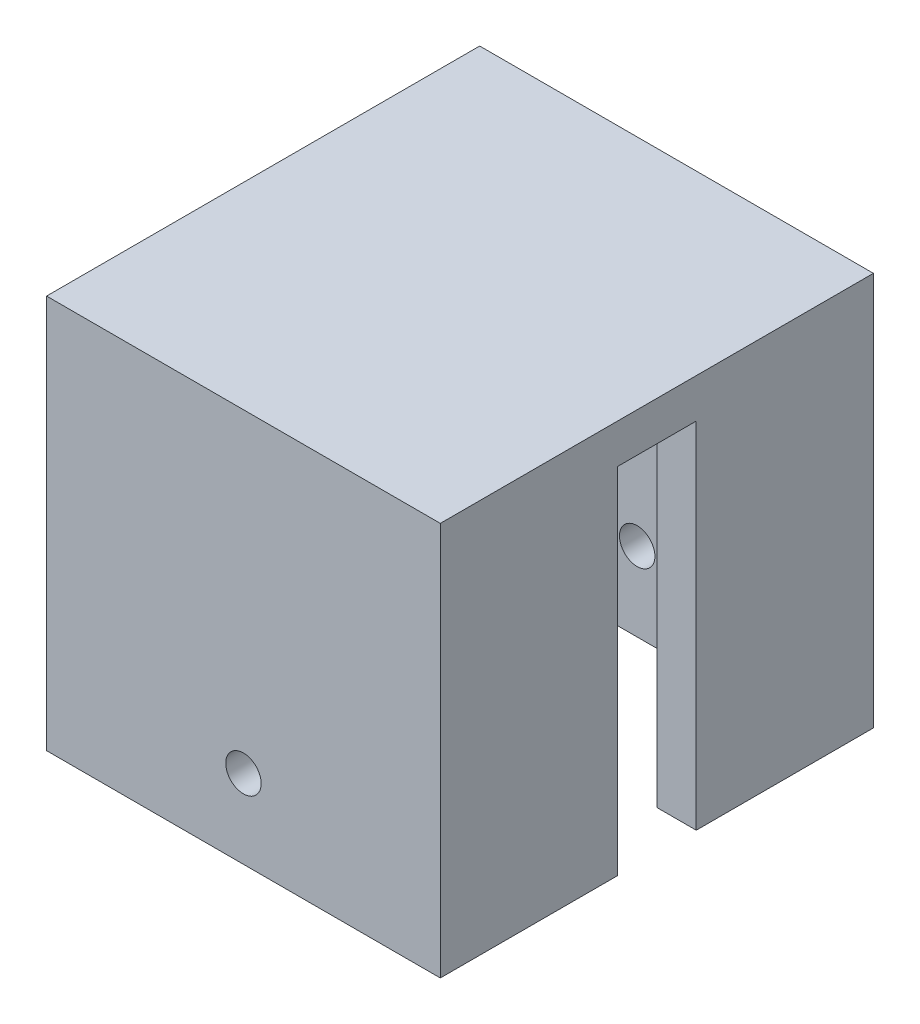
ISO-10303-21;
HEADER;
FILE_DESCRIPTION(('STEP AP214'),'2;1');
FILE_NAME('part.step','',(''),(''),'','','');
FILE_SCHEMA(('AUTOMOTIVE_DESIGN { 1 0 10303 214 1 1 1 1 }'));
ENDSEC;
DATA;
#1=APPLICATION_CONTEXT('core data for automotive mechanical design processes');
#2=APPLICATION_PROTOCOL_DEFINITION('international standard','automotive_design',2000,#1);
#3=PRODUCT_CONTEXT('',#1,'mechanical');
#4=PRODUCT('Part','Part','',(#3));
#5=PRODUCT_RELATED_PRODUCT_CATEGORY('part','',(#4));
#6=PRODUCT_DEFINITION_FORMATION('','',#4);
#7=PRODUCT_DEFINITION_CONTEXT('part definition',#1,'design');
#8=PRODUCT_DEFINITION('design','',#6,#7);
#9=PRODUCT_DEFINITION_SHAPE('','',#8);
#10=(LENGTH_UNIT() NAMED_UNIT(*) SI_UNIT(.MILLI.,.METRE.));
#11=(NAMED_UNIT(*) PLANE_ANGLE_UNIT() SI_UNIT($,.RADIAN.));
#12=(NAMED_UNIT(*) SI_UNIT($,.STERADIAN.) SOLID_ANGLE_UNIT());
#13=UNCERTAINTY_MEASURE_WITH_UNIT(LENGTH_MEASURE(1.E-05),#10,'distance_accuracy_value','');
#14=(GEOMETRIC_REPRESENTATION_CONTEXT(3) GLOBAL_UNCERTAINTY_ASSIGNED_CONTEXT((#13)) GLOBAL_UNIT_ASSIGNED_CONTEXT((#10,
#11,#12)) REPRESENTATION_CONTEXT('',''));
#15=CARTESIAN_POINT('',(0.,0.,0.));
#16=DIRECTION('',(0.,0.,1.));
#17=DIRECTION('',(1.,0.,0.));
#18=AXIS2_PLACEMENT_3D('',#15,#16,#17);
#19=CARTESIAN_POINT('',(0.,0.,55.));
#20=DIRECTION('',(0.,1.,0.));
#21=DIRECTION('',(0.,0.,1.));
#22=AXIS2_PLACEMENT_3D('',#19,#20,#21);
#23=PLANE('',#22);
#24=DIRECTION('',(0.,0.,-1.));
#25=VECTOR('',#24,1.);
#26=CARTESIAN_POINT('',(0.,0.,55.));
#27=LINE('',#26,#25);
#28=CARTESIAN_POINT('',(0.,0.,55.));
#29=VERTEX_POINT('',#28);
#30=CARTESIAN_POINT('',(0.,0.,32.5));
#31=VERTEX_POINT('',#30);
#32=EDGE_CURVE('E11',#29,#31,#27,.T.);
#33=ORIENTED_EDGE('',*,*,#32,.T.);
#34=DIRECTION('',(1.,0.,0.));
#35=VECTOR('',#34,1.);
#36=CARTESIAN_POINT('',(0.,0.,32.5));
#37=LINE('',#36,#35);
#38=CARTESIAN_POINT('',(5.,0.,32.5));
#39=VERTEX_POINT('',#38);
#40=EDGE_CURVE('E153',#31,#39,#37,.T.);
#41=ORIENTED_EDGE('',*,*,#40,.T.);
#42=DIRECTION('',(0.,0.,-1.));
#43=VECTOR('',#42,1.);
#44=CARTESIAN_POINT('',(5.,0.,55.));
#45=LINE('',#44,#43);
#46=CARTESIAN_POINT('',(5.,0.,50.));
#47=VERTEX_POINT('',#46);
#48=EDGE_CURVE('E214',#47,#39,#45,.T.);
#49=ORIENTED_EDGE('',*,*,#48,.F.);
#50=DIRECTION('',(1.,0.,0.));
#51=VECTOR('',#50,1.);
#52=CARTESIAN_POINT('',(0.,0.,50.));
#53=LINE('',#52,#51);
#54=CARTESIAN_POINT('',(45.,0.,50.));
#55=VERTEX_POINT('',#54);
#56=EDGE_CURVE('E201',#47,#55,#53,.T.);
#57=ORIENTED_EDGE('',*,*,#56,.T.);
#58=DIRECTION('',(0.,0.,-1.));
#59=VECTOR('',#58,1.);
#60=CARTESIAN_POINT('',(45.,0.,55.));
#61=LINE('',#60,#59);
#62=CARTESIAN_POINT('',(45.,0.,32.5));
#63=VERTEX_POINT('',#62);
#64=EDGE_CURVE('E334',#55,#63,#61,.T.);
#65=ORIENTED_EDGE('',*,*,#64,.T.);
#66=CARTESIAN_POINT('',(50.,0.,32.5));
#67=VERTEX_POINT('',#66);
#68=EDGE_CURVE('E165',#63,#67,#37,.T.);
#69=ORIENTED_EDGE('',*,*,#68,.T.);
#70=DIRECTION('',(0.,0.,-1.));
#71=VECTOR('',#70,1.);
#72=CARTESIAN_POINT('',(50.,0.,55.));
#73=LINE('',#72,#71);
#74=CARTESIAN_POINT('',(50.,0.,55.));
#75=VERTEX_POINT('',#74);
#76=EDGE_CURVE('E182',#75,#67,#73,.T.);
#77=ORIENTED_EDGE('',*,*,#76,.F.);
#78=DIRECTION('',(1.,0.,0.));
#79=VECTOR('',#78,1.);
#80=CARTESIAN_POINT('',(0.,0.,55.));
#81=LINE('',#80,#79);
#82=EDGE_CURVE('E178',#29,#75,#81,.T.);
#83=ORIENTED_EDGE('',*,*,#82,.F.);
#84=EDGE_LOOP('',(#33,#41,#49,#57,#65,#69,#77,#83));
#85=FACE_BOUND('',#84,.T.);
#86=ADVANCED_FACE('F38',(#85),#23,.F.);
#87=CARTESIAN_POINT('',(5.,0.,55.));
#88=DIRECTION('',(1.,0.,0.));
#89=DIRECTION('',(0.,0.,-1.));
#90=AXIS2_PLACEMENT_3D('',#87,#88,#89);
#91=PLANE('',#90);
#92=DIRECTION('',(0.,-1.,0.));
#93=VECTOR('',#92,1.);
#94=CARTESIAN_POINT('',(5.,0.,32.5));
#95=LINE('',#94,#93);
#96=CARTESIAN_POINT('',(5.,45.,32.5));
#97=VERTEX_POINT('',#96);
#98=EDGE_CURVE('E159',#97,#39,#95,.T.);
#99=ORIENTED_EDGE('',*,*,#98,.F.);
#100=DIRECTION('',(0.,0.,-1.));
#101=VECTOR('',#100,1.);
#102=CARTESIAN_POINT('',(5.,45.,55.));
#103=LINE('',#102,#101);
#104=CARTESIAN_POINT('',(5.,45.,50.));
#105=VERTEX_POINT('',#104);
#106=EDGE_CURVE('E305',#105,#97,#103,.T.);
#107=ORIENTED_EDGE('',*,*,#106,.F.);
#108=DIRECTION('',(0.,-1.,0.));
#109=VECTOR('',#108,1.);
#110=CARTESIAN_POINT('',(5.,0.,50.));
#111=LINE('',#110,#109);
#112=EDGE_CURVE('E301',#105,#47,#111,.T.);
#113=ORIENTED_EDGE('',*,*,#112,.T.);
#114=ORIENTED_EDGE('',*,*,#48,.T.);
#115=EDGE_LOOP('',(#99,#107,#113,#114));
#116=FACE_BOUND('',#115,.T.);
#117=ADVANCED_FACE('F377',(#116),#91,.T.);
#118=CARTESIAN_POINT('',(45.,0.,55.));
#119=DIRECTION('',(-1.,0.,0.));
#120=DIRECTION('',(0.,0.,1.));
#121=AXIS2_PLACEMENT_3D('',#118,#119,#120);
#122=PLANE('',#121);
#123=DIRECTION('',(0.,1.,0.));
#124=VECTOR('',#123,1.);
#125=CARTESIAN_POINT('',(45.,0.,32.5));
#126=LINE('',#125,#124);
#127=CARTESIAN_POINT('',(45.,45.,32.5));
#128=VERTEX_POINT('',#127);
#129=EDGE_CURVE('E279',#63,#128,#126,.T.);
#130=ORIENTED_EDGE('',*,*,#129,.F.);
#131=ORIENTED_EDGE('',*,*,#64,.F.);
#132=DIRECTION('',(0.,1.,0.));
#133=VECTOR('',#132,1.);
#134=CARTESIAN_POINT('',(45.,0.,50.));
#135=LINE('',#134,#133);
#136=CARTESIAN_POINT('',(45.,45.,50.));
#137=VERTEX_POINT('',#136);
#138=EDGE_CURVE('E318',#55,#137,#135,.T.);
#139=ORIENTED_EDGE('',*,*,#138,.T.);
#140=DIRECTION('',(0.,0.,-1.));
#141=VECTOR('',#140,1.);
#142=CARTESIAN_POINT('',(45.,45.,55.));
#143=LINE('',#142,#141);
#144=EDGE_CURVE('E319',#137,#128,#143,.T.);
#145=ORIENTED_EDGE('',*,*,#144,.T.);
#146=EDGE_LOOP('',(#130,#131,#139,#145));
#147=FACE_BOUND('',#146,.T.);
#148=ADVANCED_FACE('F366',(#147),#122,.T.);
#149=CARTESIAN_POINT('',(50.,0.,22.5));
#150=VERTEX_POINT('',#149);
#151=CARTESIAN_POINT('',(50.,0.,0.));
#152=VERTEX_POINT('',#151);
#153=EDGE_CURVE('E226',#150,#152,#73,.T.);
#154=ORIENTED_EDGE('',*,*,#153,.F.);
#155=DIRECTION('',(1.,0.,0.));
#156=VECTOR('',#155,1.);
#157=CARTESIAN_POINT('',(0.,0.,22.5));
#158=LINE('',#157,#156);
#159=CARTESIAN_POINT('',(45.,0.,22.5));
#160=VERTEX_POINT('',#159);
#161=EDGE_CURVE('E164',#160,#150,#158,.T.);
#162=ORIENTED_EDGE('',*,*,#161,.F.);
#163=CARTESIAN_POINT('',(45.,0.,5.));
#164=VERTEX_POINT('',#163);
#165=EDGE_CURVE('E323',#160,#164,#61,.T.);
#166=ORIENTED_EDGE('',*,*,#165,.T.);
#167=DIRECTION('',(1.,0.,0.));
#168=VECTOR('',#167,1.);
#169=CARTESIAN_POINT('',(0.,0.,5.));
#170=LINE('',#169,#168);
#171=CARTESIAN_POINT('',(5.,0.,5.));
#172=VERTEX_POINT('',#171);
#173=EDGE_CURVE('E300',#172,#164,#170,.T.);
#174=ORIENTED_EDGE('',*,*,#173,.F.);
#175=CARTESIAN_POINT('',(5.,0.,22.5));
#176=VERTEX_POINT('',#175);
#177=EDGE_CURVE('E331',#176,#172,#45,.T.);
#178=ORIENTED_EDGE('',*,*,#177,.F.);
#179=CARTESIAN_POINT('',(0.,0.,22.5));
#180=VERTEX_POINT('',#179);
#181=EDGE_CURVE('E55',#180,#176,#158,.T.);
#182=ORIENTED_EDGE('',*,*,#181,.F.);
#183=CARTESIAN_POINT('',(0.,0.,0.));
#184=VERTEX_POINT('',#183);
#185=EDGE_CURVE('E48',#180,#184,#27,.T.);
#186=ORIENTED_EDGE('',*,*,#185,.T.);
#187=DIRECTION('',(1.,0.,0.));
#188=VECTOR('',#187,1.);
#189=CARTESIAN_POINT('',(0.,0.,0.));
#190=LINE('',#189,#188);
#191=EDGE_CURVE('E213',#184,#152,#190,.T.);
#192=ORIENTED_EDGE('',*,*,#191,.T.);
#193=EDGE_LOOP('',(#154,#162,#166,#174,#178,#182,#186,#192));
#194=FACE_BOUND('',#193,.T.);
#195=ADVANCED_FACE('F242',(#194),#23,.F.);
#196=CARTESIAN_POINT('',(0.,0.,55.));
#197=DIRECTION('',(1.,0.,0.));
#198=DIRECTION('',(0.,0.,-1.));
#199=AXIS2_PLACEMENT_3D('',#196,#197,#198);
#200=PLANE('',#199);
#201=DIRECTION('',(0.,0.,1.));
#202=VECTOR('',#201,1.);
#203=CARTESIAN_POINT('',(0.,45.,32.5));
#204=LINE('',#203,#202);
#205=CARTESIAN_POINT('',(0.,45.,22.5));
#206=VERTEX_POINT('',#205);
#207=CARTESIAN_POINT('',(0.,45.,32.5));
#208=VERTEX_POINT('',#207);
#209=EDGE_CURVE('E172',#206,#208,#204,.T.);
#210=ORIENTED_EDGE('',*,*,#209,.T.);
#211=DIRECTION('',(0.,-1.,0.));
#212=VECTOR('',#211,1.);
#213=CARTESIAN_POINT('',(0.,0.,32.5));
#214=LINE('',#213,#212);
#215=EDGE_CURVE('E156',#208,#31,#214,.T.);
#216=ORIENTED_EDGE('',*,*,#215,.T.);
#217=ORIENTED_EDGE('',*,*,#32,.F.);
#218=DIRECTION('',(0.,-1.,0.));
#219=VECTOR('',#218,1.);
#220=CARTESIAN_POINT('',(0.,0.,55.));
#221=LINE('',#220,#219);
#222=CARTESIAN_POINT('',(0.,50.,55.));
#223=VERTEX_POINT('',#222);
#224=EDGE_CURVE('E187',#223,#29,#221,.T.);
#225=ORIENTED_EDGE('',*,*,#224,.F.);
#226=DIRECTION('',(0.,0.,-1.));
#227=VECTOR('',#226,1.);
#228=CARTESIAN_POINT('',(0.,50.,55.));
#229=LINE('',#228,#227);
#230=CARTESIAN_POINT('',(0.,50.,0.));
#231=VERTEX_POINT('',#230);
#232=EDGE_CURVE('E208',#223,#231,#229,.T.);
#233=ORIENTED_EDGE('',*,*,#232,.T.);
#234=DIRECTION('',(0.,-1.,0.));
#235=VECTOR('',#234,1.);
#236=CARTESIAN_POINT('',(0.,0.,0.));
#237=LINE('',#236,#235);
#238=EDGE_CURVE('E209',#231,#184,#237,.T.);
#239=ORIENTED_EDGE('',*,*,#238,.T.);
#240=ORIENTED_EDGE('',*,*,#185,.F.);
#241=DIRECTION('',(0.,1.,0.));
#242=VECTOR('',#241,1.);
#243=CARTESIAN_POINT('',(0.,0.,22.5));
#244=LINE('',#243,#242);
#245=EDGE_CURVE('E174',#180,#206,#244,.T.);
#246=ORIENTED_EDGE('',*,*,#245,.T.);
#247=EDGE_LOOP('',(#210,#216,#217,#225,#233,#239,#240,#246));
#248=FACE_BOUND('',#247,.T.);
#249=ADVANCED_FACE('F40',(#248),#200,.F.);
#250=CARTESIAN_POINT('',(50.,0.,55.));
#251=DIRECTION('',(-1.,0.,0.));
#252=DIRECTION('',(0.,0.,1.));
#253=AXIS2_PLACEMENT_3D('',#250,#251,#252);
#254=PLANE('',#253);
#255=ORIENTED_EDGE('',*,*,#76,.T.);
#256=DIRECTION('',(0.,-1.,0.));
#257=VECTOR('',#256,1.);
#258=CARTESIAN_POINT('',(50.,0.,32.5));
#259=LINE('',#258,#257);
#260=CARTESIAN_POINT('',(50.,45.,32.5));
#261=VERTEX_POINT('',#260);
#262=EDGE_CURVE('E255',#261,#67,#259,.T.);
#263=ORIENTED_EDGE('',*,*,#262,.F.);
#264=DIRECTION('',(0.,0.,1.));
#265=VECTOR('',#264,1.);
#266=CARTESIAN_POINT('',(50.,45.,32.5));
#267=LINE('',#266,#265);
#268=CARTESIAN_POINT('',(50.,45.,22.5));
#269=VERTEX_POINT('',#268);
#270=EDGE_CURVE('E175',#269,#261,#267,.T.);
#271=ORIENTED_EDGE('',*,*,#270,.F.);
#272=DIRECTION('',(0.,1.,0.));
#273=VECTOR('',#272,1.);
#274=CARTESIAN_POINT('',(50.,0.,22.5));
#275=LINE('',#274,#273);
#276=EDGE_CURVE('E238',#150,#269,#275,.T.);
#277=ORIENTED_EDGE('',*,*,#276,.F.);
#278=ORIENTED_EDGE('',*,*,#153,.T.);
#279=DIRECTION('',(0.,1.,0.));
#280=VECTOR('',#279,1.);
#281=CARTESIAN_POINT('',(50.,0.,0.));
#282=LINE('',#281,#280);
#283=CARTESIAN_POINT('',(50.,50.,0.));
#284=VERTEX_POINT('',#283);
#285=EDGE_CURVE('E198',#152,#284,#282,.T.);
#286=ORIENTED_EDGE('',*,*,#285,.T.);
#287=DIRECTION('',(0.,0.,-1.));
#288=VECTOR('',#287,1.);
#289=CARTESIAN_POINT('',(50.,50.,55.));
#290=LINE('',#289,#288);
#291=CARTESIAN_POINT('',(50.,50.,55.));
#292=VERTEX_POINT('',#291);
#293=EDGE_CURVE('E222',#292,#284,#290,.T.);
#294=ORIENTED_EDGE('',*,*,#293,.F.);
#295=DIRECTION('',(0.,1.,0.));
#296=VECTOR('',#295,1.);
#297=CARTESIAN_POINT('',(50.,0.,55.));
#298=LINE('',#297,#296);
#299=EDGE_CURVE('E186',#75,#292,#298,.T.);
#300=ORIENTED_EDGE('',*,*,#299,.F.);
#301=EDGE_LOOP('',(#255,#263,#271,#277,#278,#286,#294,#300));
#302=FACE_BOUND('',#301,.T.);
#303=ADVANCED_FACE('F234',(#302),#254,.F.);
#304=CARTESIAN_POINT('',(0.,50.,55.));
#305=DIRECTION('',(0.,-1.,0.));
#306=DIRECTION('',(0.,0.,-1.));
#307=AXIS2_PLACEMENT_3D('',#304,#305,#306);
#308=PLANE('',#307);
#309=DIRECTION('',(-1.,0.,0.));
#310=VECTOR('',#309,1.);
#311=CARTESIAN_POINT('',(0.,50.,0.));
#312=LINE('',#311,#310);
#313=EDGE_CURVE('E195',#284,#231,#312,.T.);
#314=ORIENTED_EDGE('',*,*,#313,.T.);
#315=ORIENTED_EDGE('',*,*,#232,.F.);
#316=DIRECTION('',(-1.,0.,0.));
#317=VECTOR('',#316,1.);
#318=CARTESIAN_POINT('',(0.,50.,55.));
#319=LINE('',#318,#317);
#320=EDGE_CURVE('E191',#292,#223,#319,.T.);
#321=ORIENTED_EDGE('',*,*,#320,.F.);
#322=ORIENTED_EDGE('',*,*,#293,.T.);
#323=EDGE_LOOP('',(#314,#315,#321,#322));
#324=FACE_BOUND('',#323,.T.);
#325=ADVANCED_FACE('F249',(#324),#308,.F.);
#326=CARTESIAN_POINT('',(0.,0.,55.));
#327=DIRECTION('',(0.,0.,-1.));
#328=DIRECTION('',(-1.,0.,0.));
#329=AXIS2_PLACEMENT_3D('',#326,#327,#328);
#330=PLANE('',#329);
#331=CARTESIAN_POINT('',(25.,10.,55.));
#332=DIRECTION('',(0.,0.,1.));
#333=DIRECTION('',(1.,0.,0.));
#334=AXIS2_PLACEMENT_3D('',#331,#332,#333);
#335=CIRCLE('',#334,2.25);
#336=CARTESIAN_POINT('',(27.25,10.,55.));
#337=VERTEX_POINT('',#336);
#338=EDGE_CURVE('E284',#337,#337,#335,.T.);
#339=ORIENTED_EDGE('',*,*,#338,.F.);
#340=EDGE_LOOP('',(#339));
#341=FACE_BOUND('',#340,.T.);
#342=ORIENTED_EDGE('',*,*,#224,.T.);
#343=ORIENTED_EDGE('',*,*,#82,.T.);
#344=ORIENTED_EDGE('',*,*,#299,.T.);
#345=ORIENTED_EDGE('',*,*,#320,.T.);
#346=EDGE_LOOP('',(#342,#343,#344,#345));
#347=FACE_BOUND('',#346,.T.);
#348=ADVANCED_FACE('F189',(#341,#347),#330,.F.);
#349=CARTESIAN_POINT('',(0.,0.,0.));
#350=DIRECTION('',(0.,0.,-1.));
#351=DIRECTION('',(-1.,0.,0.));
#352=AXIS2_PLACEMENT_3D('',#349,#350,#351);
#353=PLANE('',#352);
#354=CARTESIAN_POINT('',(25.,10.,0.));
#355=DIRECTION('',(0.,0.,1.));
#356=DIRECTION('',(1.,0.,0.));
#357=AXIS2_PLACEMENT_3D('',#354,#355,#356);
#358=CIRCLE('',#357,2.25);
#359=CARTESIAN_POINT('',(27.25,10.,0.));
#360=VERTEX_POINT('',#359);
#361=EDGE_CURVE('E285',#360,#360,#358,.T.);
#362=ORIENTED_EDGE('',*,*,#361,.T.);
#363=EDGE_LOOP('',(#362));
#364=FACE_BOUND('',#363,.T.);
#365=ORIENTED_EDGE('',*,*,#238,.F.);
#366=ORIENTED_EDGE('',*,*,#313,.F.);
#367=ORIENTED_EDGE('',*,*,#285,.F.);
#368=ORIENTED_EDGE('',*,*,#191,.F.);
#369=EDGE_LOOP('',(#365,#366,#367,#368));
#370=FACE_BOUND('',#369,.T.);
#371=ADVANCED_FACE('F247',(#364,#370),#353,.T.);
#372=DIRECTION('',(0.,1.,0.));
#373=VECTOR('',#372,1.);
#374=CARTESIAN_POINT('',(5.,0.,22.5));
#375=LINE('',#374,#373);
#376=CARTESIAN_POINT('',(5.,45.,22.5));
#377=VERTEX_POINT('',#376);
#378=EDGE_CURVE('E276',#176,#377,#375,.T.);
#379=ORIENTED_EDGE('',*,*,#378,.F.);
#380=ORIENTED_EDGE('',*,*,#177,.T.);
#381=DIRECTION('',(0.,-1.,0.));
#382=VECTOR('',#381,1.);
#383=CARTESIAN_POINT('',(5.,0.,5.));
#384=LINE('',#383,#382);
#385=CARTESIAN_POINT('',(5.,45.,5.));
#386=VERTEX_POINT('',#385);
#387=EDGE_CURVE('E296',#386,#172,#384,.T.);
#388=ORIENTED_EDGE('',*,*,#387,.F.);
#389=EDGE_CURVE('E310',#377,#386,#103,.T.);
#390=ORIENTED_EDGE('',*,*,#389,.F.);
#391=EDGE_LOOP('',(#379,#380,#388,#390));
#392=FACE_BOUND('',#391,.T.);
#393=ADVANCED_FACE('F380',(#392),#91,.T.);
#394=DIRECTION('',(0.,-1.,0.));
#395=VECTOR('',#394,1.);
#396=CARTESIAN_POINT('',(45.,0.,22.5));
#397=LINE('',#396,#395);
#398=CARTESIAN_POINT('',(45.,45.,22.5));
#399=VERTEX_POINT('',#398);
#400=EDGE_CURVE('E266',#399,#160,#397,.T.);
#401=ORIENTED_EDGE('',*,*,#400,.F.);
#402=CARTESIAN_POINT('',(45.,45.,5.));
#403=VERTEX_POINT('',#402);
#404=EDGE_CURVE('E309',#399,#403,#143,.T.);
#405=ORIENTED_EDGE('',*,*,#404,.T.);
#406=DIRECTION('',(0.,1.,0.));
#407=VECTOR('',#406,1.);
#408=CARTESIAN_POINT('',(45.,0.,5.));
#409=LINE('',#408,#407);
#410=EDGE_CURVE('E314',#164,#403,#409,.T.);
#411=ORIENTED_EDGE('',*,*,#410,.F.);
#412=ORIENTED_EDGE('',*,*,#165,.F.);
#413=EDGE_LOOP('',(#401,#405,#411,#412));
#414=FACE_BOUND('',#413,.T.);
#415=ADVANCED_FACE('F349',(#414),#122,.T.);
#416=CARTESIAN_POINT('',(0.,45.,55.));
#417=DIRECTION('',(0.,-1.,0.));
#418=DIRECTION('',(0.,0.,-1.));
#419=AXIS2_PLACEMENT_3D('',#416,#417,#418);
#420=PLANE('',#419);
#421=ORIENTED_EDGE('',*,*,#404,.F.);
#422=DIRECTION('',(1.,0.,0.));
#423=VECTOR('',#422,1.);
#424=CARTESIAN_POINT('',(0.,45.,22.5));
#425=LINE('',#424,#423);
#426=EDGE_CURVE('E63',#399,#269,#425,.T.);
#427=ORIENTED_EDGE('',*,*,#426,.T.);
#428=ORIENTED_EDGE('',*,*,#270,.T.);
#429=DIRECTION('',(1.,0.,0.));
#430=VECTOR('',#429,1.);
#431=CARTESIAN_POINT('',(0.,45.,32.5));
#432=LINE('',#431,#430);
#433=EDGE_CURVE('E267',#128,#261,#432,.T.);
#434=ORIENTED_EDGE('',*,*,#433,.F.);
#435=ORIENTED_EDGE('',*,*,#144,.F.);
#436=DIRECTION('',(-1.,0.,0.));
#437=VECTOR('',#436,1.);
#438=CARTESIAN_POINT('',(0.,45.,50.));
#439=LINE('',#438,#437);
#440=EDGE_CURVE('E315',#137,#105,#439,.T.);
#441=ORIENTED_EDGE('',*,*,#440,.T.);
#442=ORIENTED_EDGE('',*,*,#106,.T.);
#443=EDGE_CURVE('E263',#208,#97,#432,.T.);
#444=ORIENTED_EDGE('',*,*,#443,.F.);
#445=ORIENTED_EDGE('',*,*,#209,.F.);
#446=EDGE_CURVE('E268',#206,#377,#425,.T.);
#447=ORIENTED_EDGE('',*,*,#446,.T.);
#448=ORIENTED_EDGE('',*,*,#389,.T.);
#449=DIRECTION('',(-1.,0.,0.));
#450=VECTOR('',#449,1.);
#451=CARTESIAN_POINT('',(0.,45.,5.));
#452=LINE('',#451,#450);
#453=EDGE_CURVE('E304',#403,#386,#452,.T.);
#454=ORIENTED_EDGE('',*,*,#453,.F.);
#455=EDGE_LOOP('',(#421,#427,#428,#434,#435,#441,#442,#444,#445,#447,#448,#454));
#456=FACE_BOUND('',#455,.T.);
#457=ADVANCED_FACE('F370',(#456),#420,.T.);
#458=CARTESIAN_POINT('',(0.,0.,50.));
#459=DIRECTION('',(0.,0.,-1.));
#460=DIRECTION('',(-1.,0.,0.));
#461=AXIS2_PLACEMENT_3D('',#458,#459,#460);
#462=PLANE('',#461);
#463=CARTESIAN_POINT('',(25.,10.,50.));
#464=DIRECTION('',(0.,0.,-1.));
#465=DIRECTION('',(-1.,0.,0.));
#466=AXIS2_PLACEMENT_3D('',#463,#464,#465);
#467=CIRCLE('',#466,2.25);
#468=CARTESIAN_POINT('',(22.75,10.,50.));
#469=VERTEX_POINT('',#468);
#470=EDGE_CURVE('E292',#469,#469,#467,.T.);
#471=ORIENTED_EDGE('',*,*,#470,.F.);
#472=EDGE_LOOP('',(#471));
#473=FACE_BOUND('',#472,.T.);
#474=ORIENTED_EDGE('',*,*,#112,.F.);
#475=ORIENTED_EDGE('',*,*,#440,.F.);
#476=ORIENTED_EDGE('',*,*,#138,.F.);
#477=ORIENTED_EDGE('',*,*,#56,.F.);
#478=EDGE_LOOP('',(#474,#475,#476,#477));
#479=FACE_BOUND('',#478,.T.);
#480=ADVANCED_FACE('F374',(#473,#479),#462,.T.);
#481=CARTESIAN_POINT('',(0.,0.,5.));
#482=DIRECTION('',(0.,0.,-1.));
#483=DIRECTION('',(-1.,0.,0.));
#484=AXIS2_PLACEMENT_3D('',#481,#482,#483);
#485=PLANE('',#484);
#486=CARTESIAN_POINT('',(25.,10.,5.));
#487=DIRECTION('',(0.,0.,-1.));
#488=DIRECTION('',(-1.,0.,0.));
#489=AXIS2_PLACEMENT_3D('',#486,#487,#488);
#490=CIRCLE('',#489,2.25);
#491=CARTESIAN_POINT('',(22.75,10.,5.));
#492=VERTEX_POINT('',#491);
#493=EDGE_CURVE('E42',#492,#492,#490,.T.);
#494=ORIENTED_EDGE('',*,*,#493,.T.);
#495=EDGE_LOOP('',(#494));
#496=FACE_BOUND('',#495,.T.);
#497=ORIENTED_EDGE('',*,*,#387,.T.);
#498=ORIENTED_EDGE('',*,*,#173,.T.);
#499=ORIENTED_EDGE('',*,*,#410,.T.);
#500=ORIENTED_EDGE('',*,*,#453,.T.);
#501=EDGE_LOOP('',(#497,#498,#499,#500));
#502=FACE_BOUND('',#501,.T.);
#503=ADVANCED_FACE('F346',(#496,#502),#485,.F.);
#504=CARTESIAN_POINT('',(25.,10.,0.));
#505=DIRECTION('',(0.,0.,1.));
#506=DIRECTION('',(1.,0.,0.));
#507=AXIS2_PLACEMENT_3D('',#504,#505,#506);
#508=CYLINDRICAL_SURFACE('',#507,2.25);
#509=ORIENTED_EDGE('',*,*,#361,.F.);
#510=EDGE_LOOP('',(#509));
#511=FACE_BOUND('',#510,.T.);
#512=ORIENTED_EDGE('',*,*,#493,.F.);
#513=EDGE_LOOP('',(#512));
#514=FACE_BOUND('',#513,.T.);
#515=ADVANCED_FACE('F421',(#511,#514),#508,.F.);
#516=ORIENTED_EDGE('',*,*,#470,.T.);
#517=EDGE_LOOP('',(#516));
#518=FACE_BOUND('',#517,.T.);
#519=ORIENTED_EDGE('',*,*,#338,.T.);
#520=EDGE_LOOP('',(#519));
#521=FACE_BOUND('',#520,.T.);
#522=ADVANCED_FACE('F390',(#518,#521),#508,.F.);
#523=CARTESIAN_POINT('',(0.,0.,22.5));
#524=DIRECTION('',(0.,0.,-1.));
#525=DIRECTION('',(0.,1.,0.));
#526=AXIS2_PLACEMENT_3D('',#523,#524,#525);
#527=PLANE('',#526);
#528=ORIENTED_EDGE('',*,*,#400,.T.);
#529=ORIENTED_EDGE('',*,*,#161,.T.);
#530=ORIENTED_EDGE('',*,*,#276,.T.);
#531=ORIENTED_EDGE('',*,*,#426,.F.);
#532=EDGE_LOOP('',(#528,#529,#530,#531));
#533=FACE_BOUND('',#532,.T.);
#534=ADVANCED_FACE('F384',(#533),#527,.F.);
#535=CARTESIAN_POINT('',(0.,0.,32.5));
#536=DIRECTION('',(0.,0.,1.));
#537=DIRECTION('',(1.,0.,0.));
#538=AXIS2_PLACEMENT_3D('',#535,#536,#537);
#539=PLANE('',#538);
#540=ORIENTED_EDGE('',*,*,#129,.T.);
#541=ORIENTED_EDGE('',*,*,#433,.T.);
#542=ORIENTED_EDGE('',*,*,#262,.T.);
#543=ORIENTED_EDGE('',*,*,#68,.F.);
#544=EDGE_LOOP('',(#540,#541,#542,#543));
#545=FACE_BOUND('',#544,.T.);
#546=ADVANCED_FACE('F363',(#545),#539,.F.);
#547=ORIENTED_EDGE('',*,*,#98,.T.);
#548=ORIENTED_EDGE('',*,*,#40,.F.);
#549=ORIENTED_EDGE('',*,*,#215,.F.);
#550=ORIENTED_EDGE('',*,*,#443,.T.);
#551=EDGE_LOOP('',(#547,#548,#549,#550));
#552=FACE_BOUND('',#551,.T.);
#553=ADVANCED_FACE('F155',(#552),#539,.F.);
#554=ORIENTED_EDGE('',*,*,#378,.T.);
#555=ORIENTED_EDGE('',*,*,#446,.F.);
#556=ORIENTED_EDGE('',*,*,#245,.F.);
#557=ORIENTED_EDGE('',*,*,#181,.T.);
#558=EDGE_LOOP('',(#554,#555,#556,#557));
#559=FACE_BOUND('',#558,.T.);
#560=ADVANCED_FACE('F381',(#559),#527,.F.);
#561=CLOSED_SHELL('',(#86,#117,#148,#195,#249,#303,#325,#348,#371,#393,#415,#457,#480,#503,#515,
#522,#534,#546,#553,#560));
#562=MANIFOLD_SOLID_BREP('B2',#561);
#563=ADVANCED_BREP_SHAPE_REPRESENTATION('',(#18,#562),#14);
#564=SHAPE_DEFINITION_REPRESENTATION(#9,#563);
ENDSEC;
END-ISO-10303-21;
